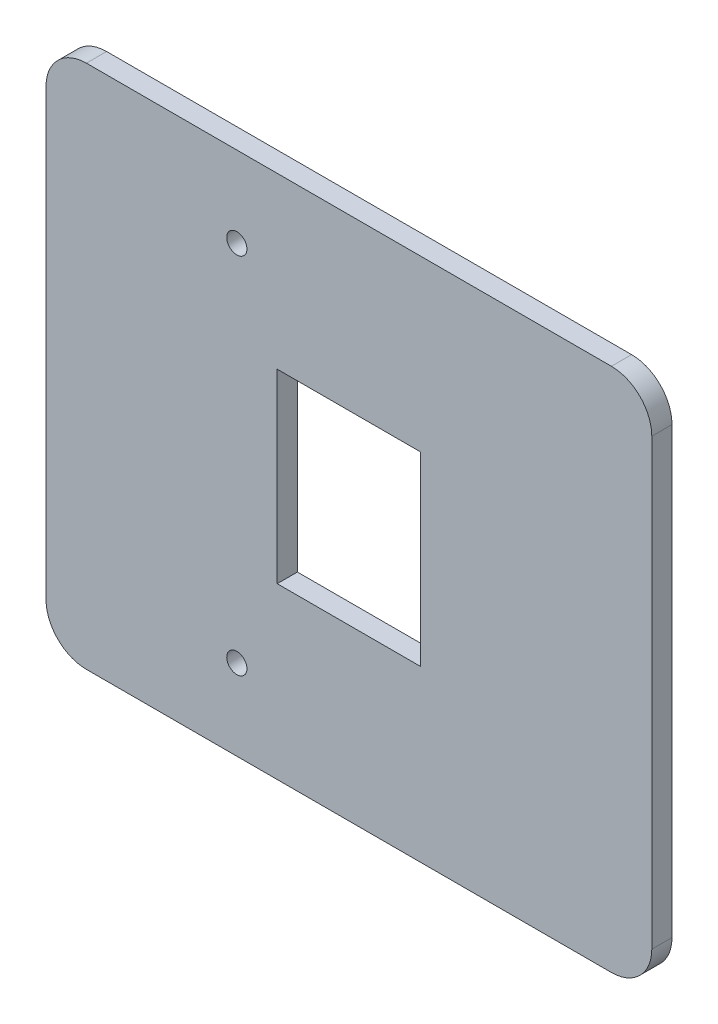
ISO-10303-21;
HEADER;
FILE_DESCRIPTION(('STEP AP214'),'2;1');
FILE_NAME('part.step','',(''),(''),'','','');
FILE_SCHEMA(('AUTOMOTIVE_DESIGN { 1 0 10303 214 1 1 1 1 }'));
ENDSEC;
DATA;
#1=APPLICATION_CONTEXT('core data for automotive mechanical design processes');
#2=APPLICATION_PROTOCOL_DEFINITION('international standard','automotive_design',2000,#1);
#3=PRODUCT_CONTEXT('',#1,'mechanical');
#4=PRODUCT('Part','Part','',(#3));
#5=PRODUCT_RELATED_PRODUCT_CATEGORY('part','',(#4));
#6=PRODUCT_DEFINITION_FORMATION('','',#4);
#7=PRODUCT_DEFINITION_CONTEXT('part definition',#1,'design');
#8=PRODUCT_DEFINITION('design','',#6,#7);
#9=PRODUCT_DEFINITION_SHAPE('','',#8);
#10=(LENGTH_UNIT() NAMED_UNIT(*) SI_UNIT(.MILLI.,.METRE.));
#11=(NAMED_UNIT(*) PLANE_ANGLE_UNIT() SI_UNIT($,.RADIAN.));
#12=(NAMED_UNIT(*) SI_UNIT($,.STERADIAN.) SOLID_ANGLE_UNIT());
#13=UNCERTAINTY_MEASURE_WITH_UNIT(LENGTH_MEASURE(1.E-05),#10,'distance_accuracy_value','');
#14=(GEOMETRIC_REPRESENTATION_CONTEXT(3) GLOBAL_UNCERTAINTY_ASSIGNED_CONTEXT((#13)) GLOBAL_UNIT_ASSIGNED_CONTEXT((#10,
#11,#12)) REPRESENTATION_CONTEXT('',''));
#15=CARTESIAN_POINT('',(0.,0.,0.));
#16=DIRECTION('',(0.,0.,1.));
#17=DIRECTION('',(1.,0.,0.));
#18=AXIS2_PLACEMENT_3D('',#15,#16,#17);
#19=CARTESIAN_POINT('',(0.,0.,5.));
#20=DIRECTION('',(0.,0.,1.));
#21=DIRECTION('',(1.,0.,0.));
#22=AXIS2_PLACEMENT_3D('',#19,#20,#21);
#23=PLANE('',#22);
#24=DIRECTION('',(0.,-1.,0.));
#25=VECTOR('',#24,1.);
#26=CARTESIAN_POINT('',(-75.,65.,5.));
#27=LINE('',#26,#25);
#28=CARTESIAN_POINT('',(-75.,55.,5.));
#29=VERTEX_POINT('',#28);
#30=CARTESIAN_POINT('',(-75.,-55.,5.));
#31=VERTEX_POINT('',#30);
#32=EDGE_CURVE('E170',#29,#31,#27,.T.);
#33=ORIENTED_EDGE('',*,*,#32,.T.);
#34=CARTESIAN_POINT('',(-65.,-55.,5.));
#35=DIRECTION('',(0.,0.,1.));
#36=DIRECTION('',(1.,0.,0.));
#37=AXIS2_PLACEMENT_3D('',#34,#35,#36);
#38=CIRCLE('',#37,10.);
#39=CARTESIAN_POINT('',(-65.,-65.,5.));
#40=VERTEX_POINT('',#39);
#41=EDGE_CURVE('E222',#31,#40,#38,.T.);
#42=ORIENTED_EDGE('',*,*,#41,.T.);
#43=DIRECTION('',(1.,0.,0.));
#44=VECTOR('',#43,1.);
#45=CARTESIAN_POINT('',(-75.,-65.,5.));
#46=LINE('',#45,#44);
#47=CARTESIAN_POINT('',(65.,-65.,5.));
#48=VERTEX_POINT('',#47);
#49=EDGE_CURVE('E173',#40,#48,#46,.T.);
#50=ORIENTED_EDGE('',*,*,#49,.T.);
#51=CARTESIAN_POINT('',(65.,-55.,5.));
#52=DIRECTION('',(0.,0.,1.));
#53=DIRECTION('',(1.,0.,0.));
#54=AXIS2_PLACEMENT_3D('',#51,#52,#53);
#55=CIRCLE('',#54,10.);
#56=CARTESIAN_POINT('',(75.,-55.,5.));
#57=VERTEX_POINT('',#56);
#58=EDGE_CURVE('E220',#48,#57,#55,.T.);
#59=ORIENTED_EDGE('',*,*,#58,.T.);
#60=DIRECTION('',(0.,1.,0.));
#61=VECTOR('',#60,1.);
#62=CARTESIAN_POINT('',(75.,65.,5.));
#63=LINE('',#62,#61);
#64=CARTESIAN_POINT('',(75.,55.,5.));
#65=VERTEX_POINT('',#64);
#66=EDGE_CURVE('E165',#57,#65,#63,.T.);
#67=ORIENTED_EDGE('',*,*,#66,.T.);
#68=CARTESIAN_POINT('',(65.,55.,5.));
#69=DIRECTION('',(0.,0.,1.));
#70=DIRECTION('',(1.,0.,0.));
#71=AXIS2_PLACEMENT_3D('',#68,#69,#70);
#72=CIRCLE('',#71,10.);
#73=CARTESIAN_POINT('',(65.,65.,5.));
#74=VERTEX_POINT('',#73);
#75=EDGE_CURVE('E56',#65,#74,#72,.T.);
#76=ORIENTED_EDGE('',*,*,#75,.T.);
#77=DIRECTION('',(-1.,0.,0.));
#78=VECTOR('',#77,1.);
#79=CARTESIAN_POINT('',(-75.,65.,5.));
#80=LINE('',#79,#78);
#81=CARTESIAN_POINT('',(-65.,65.,5.));
#82=VERTEX_POINT('',#81);
#83=EDGE_CURVE('E167',#74,#82,#80,.T.);
#84=ORIENTED_EDGE('',*,*,#83,.T.);
#85=CARTESIAN_POINT('',(-65.,55.,5.));
#86=DIRECTION('',(0.,0.,1.));
#87=DIRECTION('',(1.,0.,0.));
#88=AXIS2_PLACEMENT_3D('',#85,#86,#87);
#89=CIRCLE('',#88,10.);
#90=EDGE_CURVE('E217',#82,#29,#89,.T.);
#91=ORIENTED_EDGE('',*,*,#90,.T.);
#92=EDGE_LOOP('',(#33,#42,#50,#59,#67,#76,#84,#91));
#93=FACE_BOUND('',#92,.T.);
#94=CARTESIAN_POINT('',(-27.75,45.,5.));
#95=DIRECTION('',(0.,0.,1.));
#96=DIRECTION('',(1.,0.,0.));
#97=AXIS2_PLACEMENT_3D('',#94,#95,#96);
#98=CIRCLE('',#97,2.5);
#99=CARTESIAN_POINT('',(-25.25,45.,5.));
#100=VERTEX_POINT('',#99);
#101=EDGE_CURVE('E162',#100,#100,#98,.T.);
#102=ORIENTED_EDGE('',*,*,#101,.F.);
#103=EDGE_LOOP('',(#102));
#104=FACE_BOUND('',#103,.T.);
#105=CARTESIAN_POINT('',(-27.75,-45.,5.));
#106=DIRECTION('',(0.,0.,-1.));
#107=DIRECTION('',(-1.,0.,0.));
#108=AXIS2_PLACEMENT_3D('',#105,#106,#107);
#109=CIRCLE('',#108,2.5);
#110=CARTESIAN_POINT('',(-30.25,-45.,5.));
#111=VERTEX_POINT('',#110);
#112=EDGE_CURVE('E159',#111,#111,#109,.T.);
#113=ORIENTED_EDGE('',*,*,#112,.T.);
#114=EDGE_LOOP('',(#113));
#115=FACE_BOUND('',#114,.T.);
#116=DIRECTION('',(1.,0.,0.));
#117=VECTOR('',#116,1.);
#118=CARTESIAN_POINT('',(0.,23.,5.));
#119=LINE('',#118,#117);
#120=CARTESIAN_POINT('',(-17.75,23.,5.));
#121=VERTEX_POINT('',#120);
#122=CARTESIAN_POINT('',(17.75,23.,5.));
#123=VERTEX_POINT('',#122);
#124=EDGE_CURVE('E141',#121,#123,#119,.T.);
#125=ORIENTED_EDGE('',*,*,#124,.T.);
#126=DIRECTION('',(0.,-1.,0.));
#127=VECTOR('',#126,1.);
#128=CARTESIAN_POINT('',(17.75,0.,5.));
#129=LINE('',#128,#127);
#130=CARTESIAN_POINT('',(17.75,-23.,5.));
#131=VERTEX_POINT('',#130);
#132=EDGE_CURVE('E146',#123,#131,#129,.T.);
#133=ORIENTED_EDGE('',*,*,#132,.T.);
#134=DIRECTION('',(1.,0.,0.));
#135=VECTOR('',#134,1.);
#136=CARTESIAN_POINT('',(0.,-23.,5.));
#137=LINE('',#136,#135);
#138=CARTESIAN_POINT('',(-17.75,-23.,5.));
#139=VERTEX_POINT('',#138);
#140=EDGE_CURVE('E149',#139,#131,#137,.T.);
#141=ORIENTED_EDGE('',*,*,#140,.F.);
#142=DIRECTION('',(0.,-1.,0.));
#143=VECTOR('',#142,1.);
#144=CARTESIAN_POINT('',(-17.75,0.,5.));
#145=LINE('',#144,#143);
#146=EDGE_CURVE('E130',#121,#139,#145,.T.);
#147=ORIENTED_EDGE('',*,*,#146,.F.);
#148=EDGE_LOOP('',(#125,#133,#141,#147));
#149=FACE_BOUND('',#148,.T.);
#150=ADVANCED_FACE('F35',(#93,#104,#115,#149),#23,.T.);
#151=CARTESIAN_POINT('',(0.,0.,0.));
#152=DIRECTION('',(0.,0.,1.));
#153=DIRECTION('',(1.,0.,0.));
#154=AXIS2_PLACEMENT_3D('',#151,#152,#153);
#155=PLANE('',#154);
#156=CARTESIAN_POINT('',(-27.75,-45.,0.));
#157=DIRECTION('',(0.,0.,1.));
#158=DIRECTION('',(1.,0.,0.));
#159=AXIS2_PLACEMENT_3D('',#156,#157,#158);
#160=CIRCLE('',#159,2.5);
#161=CARTESIAN_POINT('',(-25.25,-45.,0.));
#162=VERTEX_POINT('',#161);
#163=EDGE_CURVE('E181',#162,#162,#160,.F.);
#164=ORIENTED_EDGE('',*,*,#163,.F.);
#165=EDGE_LOOP('',(#164));
#166=FACE_BOUND('',#165,.T.);
#167=DIRECTION('',(1.,0.,0.));
#168=VECTOR('',#167,1.);
#169=CARTESIAN_POINT('',(-75.,-65.,0.));
#170=LINE('',#169,#168);
#171=CARTESIAN_POINT('',(-65.,-65.,0.));
#172=VERTEX_POINT('',#171);
#173=CARTESIAN_POINT('',(65.,-65.,0.));
#174=VERTEX_POINT('',#173);
#175=EDGE_CURVE('E168',#172,#174,#170,.T.);
#176=ORIENTED_EDGE('',*,*,#175,.F.);
#177=CARTESIAN_POINT('',(-65.,-55.,0.));
#178=DIRECTION('',(0.,0.,1.));
#179=DIRECTION('',(1.,0.,0.));
#180=AXIS2_PLACEMENT_3D('',#177,#178,#179);
#181=CIRCLE('',#180,10.);
#182=CARTESIAN_POINT('',(-75.,-55.,0.));
#183=VERTEX_POINT('',#182);
#184=EDGE_CURVE('E210',#172,#183,#181,.F.);
#185=ORIENTED_EDGE('',*,*,#184,.T.);
#186=DIRECTION('',(0.,-1.,0.));
#187=VECTOR('',#186,1.);
#188=CARTESIAN_POINT('',(-75.,65.,0.));
#189=LINE('',#188,#187);
#190=CARTESIAN_POINT('',(-75.,55.,0.));
#191=VERTEX_POINT('',#190);
#192=EDGE_CURVE('E183',#191,#183,#189,.T.);
#193=ORIENTED_EDGE('',*,*,#192,.F.);
#194=CARTESIAN_POINT('',(-65.,55.,0.));
#195=DIRECTION('',(0.,0.,1.));
#196=DIRECTION('',(1.,0.,0.));
#197=AXIS2_PLACEMENT_3D('',#194,#195,#196);
#198=CIRCLE('',#197,10.);
#199=CARTESIAN_POINT('',(-65.,65.,0.));
#200=VERTEX_POINT('',#199);
#201=EDGE_CURVE('E204',#191,#200,#198,.F.);
#202=ORIENTED_EDGE('',*,*,#201,.T.);
#203=DIRECTION('',(-1.,0.,0.));
#204=VECTOR('',#203,1.);
#205=CARTESIAN_POINT('',(-75.,65.,0.));
#206=LINE('',#205,#204);
#207=CARTESIAN_POINT('',(65.,65.,0.));
#208=VERTEX_POINT('',#207);
#209=EDGE_CURVE('E180',#208,#200,#206,.T.);
#210=ORIENTED_EDGE('',*,*,#209,.F.);
#211=CARTESIAN_POINT('',(65.,55.,0.));
#212=DIRECTION('',(0.,0.,1.));
#213=DIRECTION('',(1.,0.,0.));
#214=AXIS2_PLACEMENT_3D('',#211,#212,#213);
#215=CIRCLE('',#214,10.);
#216=CARTESIAN_POINT('',(75.,55.,0.));
#217=VERTEX_POINT('',#216);
#218=EDGE_CURVE('E206',#208,#217,#215,.F.);
#219=ORIENTED_EDGE('',*,*,#218,.T.);
#220=DIRECTION('',(0.,1.,0.));
#221=VECTOR('',#220,1.);
#222=CARTESIAN_POINT('',(75.,65.,0.));
#223=LINE('',#222,#221);
#224=CARTESIAN_POINT('',(75.,-55.,0.));
#225=VERTEX_POINT('',#224);
#226=EDGE_CURVE('E177',#225,#217,#223,.T.);
#227=ORIENTED_EDGE('',*,*,#226,.F.);
#228=CARTESIAN_POINT('',(65.,-55.,0.));
#229=DIRECTION('',(0.,0.,1.));
#230=DIRECTION('',(1.,0.,0.));
#231=AXIS2_PLACEMENT_3D('',#228,#229,#230);
#232=CIRCLE('',#231,10.);
#233=EDGE_CURVE('E208',#225,#174,#232,.F.);
#234=ORIENTED_EDGE('',*,*,#233,.T.);
#235=EDGE_LOOP('',(#176,#185,#193,#202,#210,#219,#227,#234));
#236=FACE_BOUND('',#235,.T.);
#237=CARTESIAN_POINT('',(-27.75,45.,0.));
#238=DIRECTION('',(0.,0.,1.));
#239=DIRECTION('',(1.,0.,0.));
#240=AXIS2_PLACEMENT_3D('',#237,#238,#239);
#241=CIRCLE('',#240,2.5);
#242=CARTESIAN_POINT('',(-25.25,45.,0.));
#243=VERTEX_POINT('',#242);
#244=EDGE_CURVE('E156',#243,#243,#241,.T.);
#245=ORIENTED_EDGE('',*,*,#244,.T.);
#246=EDGE_LOOP('',(#245));
#247=FACE_BOUND('',#246,.T.);
#248=DIRECTION('',(0.,-1.,0.));
#249=VECTOR('',#248,1.);
#250=CARTESIAN_POINT('',(17.75,0.,0.));
#251=LINE('',#250,#249);
#252=CARTESIAN_POINT('',(17.75,23.,0.));
#253=VERTEX_POINT('',#252);
#254=CARTESIAN_POINT('',(17.75,-23.,0.));
#255=VERTEX_POINT('',#254);
#256=EDGE_CURVE('E197',#253,#255,#251,.T.);
#257=ORIENTED_EDGE('',*,*,#256,.F.);
#258=DIRECTION('',(1.,0.,0.));
#259=VECTOR('',#258,1.);
#260=CARTESIAN_POINT('',(0.,23.,0.));
#261=LINE('',#260,#259);
#262=CARTESIAN_POINT('',(-17.75,23.,0.));
#263=VERTEX_POINT('',#262);
#264=EDGE_CURVE('E176',#263,#253,#261,.T.);
#265=ORIENTED_EDGE('',*,*,#264,.F.);
#266=DIRECTION('',(0.,-1.,0.));
#267=VECTOR('',#266,1.);
#268=CARTESIAN_POINT('',(-17.75,0.,0.));
#269=LINE('',#268,#267);
#270=CARTESIAN_POINT('',(-17.75,-23.,0.));
#271=VERTEX_POINT('',#270);
#272=EDGE_CURVE('E133',#263,#271,#269,.T.);
#273=ORIENTED_EDGE('',*,*,#272,.T.);
#274=DIRECTION('',(1.,0.,0.));
#275=VECTOR('',#274,1.);
#276=CARTESIAN_POINT('',(0.,-23.,0.));
#277=LINE('',#276,#275);
#278=EDGE_CURVE('E194',#271,#255,#277,.T.);
#279=ORIENTED_EDGE('',*,*,#278,.T.);
#280=EDGE_LOOP('',(#257,#265,#273,#279));
#281=FACE_BOUND('',#280,.T.);
#282=ADVANCED_FACE('F238',(#166,#236,#247,#281),#155,.F.);
#283=CARTESIAN_POINT('',(75.,65.,5.));
#284=DIRECTION('',(-1.,0.,0.));
#285=DIRECTION('',(0.,0.,1.));
#286=AXIS2_PLACEMENT_3D('',#283,#284,#285);
#287=PLANE('',#286);
#288=ORIENTED_EDGE('',*,*,#66,.F.);
#289=DIRECTION('',(0.,0.,-1.));
#290=VECTOR('',#289,1.);
#291=CARTESIAN_POINT('',(75.,-55.,5.));
#292=LINE('',#291,#290);
#293=EDGE_CURVE('E226',#57,#225,#292,.T.);
#294=ORIENTED_EDGE('',*,*,#293,.T.);
#295=ORIENTED_EDGE('',*,*,#226,.T.);
#296=DIRECTION('',(0.,0.,-1.));
#297=VECTOR('',#296,1.);
#298=CARTESIAN_POINT('',(75.,55.,5.));
#299=LINE('',#298,#297);
#300=EDGE_CURVE('E224',#217,#65,#299,.F.);
#301=ORIENTED_EDGE('',*,*,#300,.T.);
#302=EDGE_LOOP('',(#288,#294,#295,#301));
#303=FACE_BOUND('',#302,.T.);
#304=ADVANCED_FACE('F232',(#303),#287,.F.);
#305=CARTESIAN_POINT('',(-75.,65.,5.));
#306=DIRECTION('',(0.,-1.,0.));
#307=DIRECTION('',(0.,0.,-1.));
#308=AXIS2_PLACEMENT_3D('',#305,#306,#307);
#309=PLANE('',#308);
#310=ORIENTED_EDGE('',*,*,#83,.F.);
#311=DIRECTION('',(0.,0.,-1.));
#312=VECTOR('',#311,1.);
#313=CARTESIAN_POINT('',(65.,65.,5.));
#314=LINE('',#313,#312);
#315=EDGE_CURVE('E11',#74,#208,#314,.T.);
#316=ORIENTED_EDGE('',*,*,#315,.T.);
#317=ORIENTED_EDGE('',*,*,#209,.T.);
#318=DIRECTION('',(0.,0.,-1.));
#319=VECTOR('',#318,1.);
#320=CARTESIAN_POINT('',(-65.,65.,5.));
#321=LINE('',#320,#319);
#322=EDGE_CURVE('E43',#200,#82,#321,.F.);
#323=ORIENTED_EDGE('',*,*,#322,.T.);
#324=EDGE_LOOP('',(#310,#316,#317,#323));
#325=FACE_BOUND('',#324,.T.);
#326=ADVANCED_FACE('F244',(#325),#309,.F.);
#327=CARTESIAN_POINT('',(-75.,65.,5.));
#328=DIRECTION('',(1.,0.,0.));
#329=DIRECTION('',(0.,0.,-1.));
#330=AXIS2_PLACEMENT_3D('',#327,#328,#329);
#331=PLANE('',#330);
#332=ORIENTED_EDGE('',*,*,#192,.T.);
#333=DIRECTION('',(0.,0.,-1.));
#334=VECTOR('',#333,1.);
#335=CARTESIAN_POINT('',(-75.,-55.,5.));
#336=LINE('',#335,#334);
#337=EDGE_CURVE('E215',#183,#31,#336,.F.);
#338=ORIENTED_EDGE('',*,*,#337,.T.);
#339=ORIENTED_EDGE('',*,*,#32,.F.);
#340=DIRECTION('',(0.,0.,-1.));
#341=VECTOR('',#340,1.);
#342=CARTESIAN_POINT('',(-75.,55.,5.));
#343=LINE('',#342,#341);
#344=EDGE_CURVE('E212',#29,#191,#343,.T.);
#345=ORIENTED_EDGE('',*,*,#344,.T.);
#346=EDGE_LOOP('',(#332,#338,#339,#345));
#347=FACE_BOUND('',#346,.T.);
#348=ADVANCED_FACE('F252',(#347),#331,.F.);
#349=CARTESIAN_POINT('',(-75.,-65.,5.));
#350=DIRECTION('',(0.,1.,0.));
#351=DIRECTION('',(0.,0.,1.));
#352=AXIS2_PLACEMENT_3D('',#349,#350,#351);
#353=PLANE('',#352);
#354=ORIENTED_EDGE('',*,*,#49,.F.);
#355=DIRECTION('',(0.,0.,-1.));
#356=VECTOR('',#355,1.);
#357=CARTESIAN_POINT('',(-65.,-65.,5.));
#358=LINE('',#357,#356);
#359=EDGE_CURVE('E201',#40,#172,#358,.T.);
#360=ORIENTED_EDGE('',*,*,#359,.T.);
#361=ORIENTED_EDGE('',*,*,#175,.T.);
#362=DIRECTION('',(0.,0.,-1.));
#363=VECTOR('',#362,1.);
#364=CARTESIAN_POINT('',(65.,-65.,5.));
#365=LINE('',#364,#363);
#366=EDGE_CURVE('E199',#174,#48,#365,.F.);
#367=ORIENTED_EDGE('',*,*,#366,.T.);
#368=EDGE_LOOP('',(#354,#360,#361,#367));
#369=FACE_BOUND('',#368,.T.);
#370=ADVANCED_FACE('F260',(#369),#353,.F.);
#371=CARTESIAN_POINT('',(-27.75,45.,-5.));
#372=DIRECTION('',(0.,0.,1.));
#373=DIRECTION('',(1.,0.,0.));
#374=AXIS2_PLACEMENT_3D('',#371,#372,#373);
#375=CYLINDRICAL_SURFACE('',#374,2.5);
#376=ORIENTED_EDGE('',*,*,#101,.T.);
#377=EDGE_LOOP('',(#376));
#378=FACE_BOUND('',#377,.T.);
#379=ORIENTED_EDGE('',*,*,#244,.F.);
#380=EDGE_LOOP('',(#379));
#381=FACE_BOUND('',#380,.T.);
#382=ADVANCED_FACE('F278',(#378,#381),#375,.F.);
#383=CARTESIAN_POINT('',(-27.75,-45.,-5.));
#384=DIRECTION('',(0.,0.,1.));
#385=DIRECTION('',(1.,0.,0.));
#386=AXIS2_PLACEMENT_3D('',#383,#384,#385);
#387=CYLINDRICAL_SURFACE('',#386,2.5);
#388=ORIENTED_EDGE('',*,*,#112,.F.);
#389=EDGE_LOOP('',(#388));
#390=FACE_BOUND('',#389,.T.);
#391=ORIENTED_EDGE('',*,*,#163,.T.);
#392=EDGE_LOOP('',(#391));
#393=FACE_BOUND('',#392,.T.);
#394=ADVANCED_FACE('F311',(#390,#393),#387,.F.);
#395=CARTESIAN_POINT('',(17.75,0.,-5.));
#396=DIRECTION('',(-1.,0.,0.));
#397=DIRECTION('',(0.,0.,1.));
#398=AXIS2_PLACEMENT_3D('',#395,#396,#397);
#399=PLANE('',#398);
#400=ORIENTED_EDGE('',*,*,#256,.T.);
#401=DIRECTION('',(0.,0.,1.));
#402=VECTOR('',#401,1.);
#403=CARTESIAN_POINT('',(17.75,-23.,-5.));
#404=LINE('',#403,#402);
#405=EDGE_CURVE('E154',#255,#131,#404,.T.);
#406=ORIENTED_EDGE('',*,*,#405,.T.);
#407=ORIENTED_EDGE('',*,*,#132,.F.);
#408=DIRECTION('',(0.,0.,1.));
#409=VECTOR('',#408,1.);
#410=CARTESIAN_POINT('',(17.75,23.,-5.));
#411=LINE('',#410,#409);
#412=EDGE_CURVE('E137',#253,#123,#411,.T.);
#413=ORIENTED_EDGE('',*,*,#412,.F.);
#414=EDGE_LOOP('',(#400,#406,#407,#413));
#415=FACE_BOUND('',#414,.T.);
#416=ADVANCED_FACE('F318',(#415),#399,.T.);
#417=CARTESIAN_POINT('',(0.,-23.,-5.));
#418=DIRECTION('',(0.,-1.,0.));
#419=DIRECTION('',(0.,0.,-1.));
#420=AXIS2_PLACEMENT_3D('',#417,#418,#419);
#421=PLANE('',#420);
#422=DIRECTION('',(0.,0.,1.));
#423=VECTOR('',#422,1.);
#424=CARTESIAN_POINT('',(-17.75,-23.,-5.));
#425=LINE('',#424,#423);
#426=EDGE_CURVE('E136',#271,#139,#425,.T.);
#427=ORIENTED_EDGE('',*,*,#426,.T.);
#428=ORIENTED_EDGE('',*,*,#140,.T.);
#429=ORIENTED_EDGE('',*,*,#405,.F.);
#430=ORIENTED_EDGE('',*,*,#278,.F.);
#431=EDGE_LOOP('',(#427,#428,#429,#430));
#432=FACE_BOUND('',#431,.T.);
#433=ADVANCED_FACE('F325',(#432),#421,.F.);
#434=CARTESIAN_POINT('',(-17.75,0.,-5.));
#435=DIRECTION('',(-1.,0.,0.));
#436=DIRECTION('',(0.,0.,1.));
#437=AXIS2_PLACEMENT_3D('',#434,#435,#436);
#438=PLANE('',#437);
#439=DIRECTION('',(0.,0.,1.));
#440=VECTOR('',#439,1.);
#441=CARTESIAN_POINT('',(-17.75,23.,-5.));
#442=LINE('',#441,#440);
#443=EDGE_CURVE('E125',#263,#121,#442,.T.);
#444=ORIENTED_EDGE('',*,*,#443,.T.);
#445=ORIENTED_EDGE('',*,*,#146,.T.);
#446=ORIENTED_EDGE('',*,*,#426,.F.);
#447=ORIENTED_EDGE('',*,*,#272,.F.);
#448=EDGE_LOOP('',(#444,#445,#446,#447));
#449=FACE_BOUND('',#448,.T.);
#450=ADVANCED_FACE('F127',(#449),#438,.F.);
#451=CARTESIAN_POINT('',(0.,23.,-5.));
#452=DIRECTION('',(0.,-1.,0.));
#453=DIRECTION('',(0.,0.,-1.));
#454=AXIS2_PLACEMENT_3D('',#451,#452,#453);
#455=PLANE('',#454);
#456=ORIENTED_EDGE('',*,*,#264,.T.);
#457=ORIENTED_EDGE('',*,*,#412,.T.);
#458=ORIENTED_EDGE('',*,*,#124,.F.);
#459=ORIENTED_EDGE('',*,*,#443,.F.);
#460=EDGE_LOOP('',(#456,#457,#458,#459));
#461=FACE_BOUND('',#460,.T.);
#462=ADVANCED_FACE('F142',(#461),#455,.T.);
#463=CARTESIAN_POINT('',(-65.,-55.,5.));
#464=DIRECTION('',(0.,0.,-1.));
#465=DIRECTION('',(-1.,0.,0.));
#466=AXIS2_PLACEMENT_3D('',#463,#464,#465);
#467=CYLINDRICAL_SURFACE('',#466,10.);
#468=ORIENTED_EDGE('',*,*,#41,.F.);
#469=ORIENTED_EDGE('',*,*,#337,.F.);
#470=ORIENTED_EDGE('',*,*,#184,.F.);
#471=ORIENTED_EDGE('',*,*,#359,.F.);
#472=EDGE_LOOP('',(#468,#469,#470,#471));
#473=FACE_BOUND('',#472,.T.);
#474=ADVANCED_FACE('F257',(#473),#467,.T.);
#475=CARTESIAN_POINT('',(65.,-55.,5.));
#476=DIRECTION('',(0.,0.,-1.));
#477=DIRECTION('',(-1.,0.,0.));
#478=AXIS2_PLACEMENT_3D('',#475,#476,#477);
#479=CYLINDRICAL_SURFACE('',#478,10.);
#480=ORIENTED_EDGE('',*,*,#58,.F.);
#481=ORIENTED_EDGE('',*,*,#366,.F.);
#482=ORIENTED_EDGE('',*,*,#233,.F.);
#483=ORIENTED_EDGE('',*,*,#293,.F.);
#484=EDGE_LOOP('',(#480,#481,#482,#483));
#485=FACE_BOUND('',#484,.T.);
#486=ADVANCED_FACE('F262',(#485),#479,.T.);
#487=CARTESIAN_POINT('',(65.,55.,5.));
#488=DIRECTION('',(0.,0.,-1.));
#489=DIRECTION('',(-1.,0.,0.));
#490=AXIS2_PLACEMENT_3D('',#487,#488,#489);
#491=CYLINDRICAL_SURFACE('',#490,10.);
#492=ORIENTED_EDGE('',*,*,#75,.F.);
#493=ORIENTED_EDGE('',*,*,#300,.F.);
#494=ORIENTED_EDGE('',*,*,#218,.F.);
#495=ORIENTED_EDGE('',*,*,#315,.F.);
#496=EDGE_LOOP('',(#492,#493,#494,#495));
#497=FACE_BOUND('',#496,.T.);
#498=ADVANCED_FACE('F243',(#497),#491,.T.);
#499=CARTESIAN_POINT('',(-65.,55.,5.));
#500=DIRECTION('',(0.,0.,-1.));
#501=DIRECTION('',(-1.,0.,0.));
#502=AXIS2_PLACEMENT_3D('',#499,#500,#501);
#503=CYLINDRICAL_SURFACE('',#502,10.);
#504=ORIENTED_EDGE('',*,*,#90,.F.);
#505=ORIENTED_EDGE('',*,*,#322,.F.);
#506=ORIENTED_EDGE('',*,*,#201,.F.);
#507=ORIENTED_EDGE('',*,*,#344,.F.);
#508=EDGE_LOOP('',(#504,#505,#506,#507));
#509=FACE_BOUND('',#508,.T.);
#510=ADVANCED_FACE('F37',(#509),#503,.T.);
#511=CLOSED_SHELL('',(#150,#282,#304,#326,#348,#370,#382,#394,#416,#433,#450,#462,#474,#486,
#498,#510));
#512=MANIFOLD_SOLID_BREP('B2',#511);
#513=ADVANCED_BREP_SHAPE_REPRESENTATION('',(#18,#512),#14);
#514=SHAPE_DEFINITION_REPRESENTATION(#9,#513);
ENDSEC;
END-ISO-10303-21;
